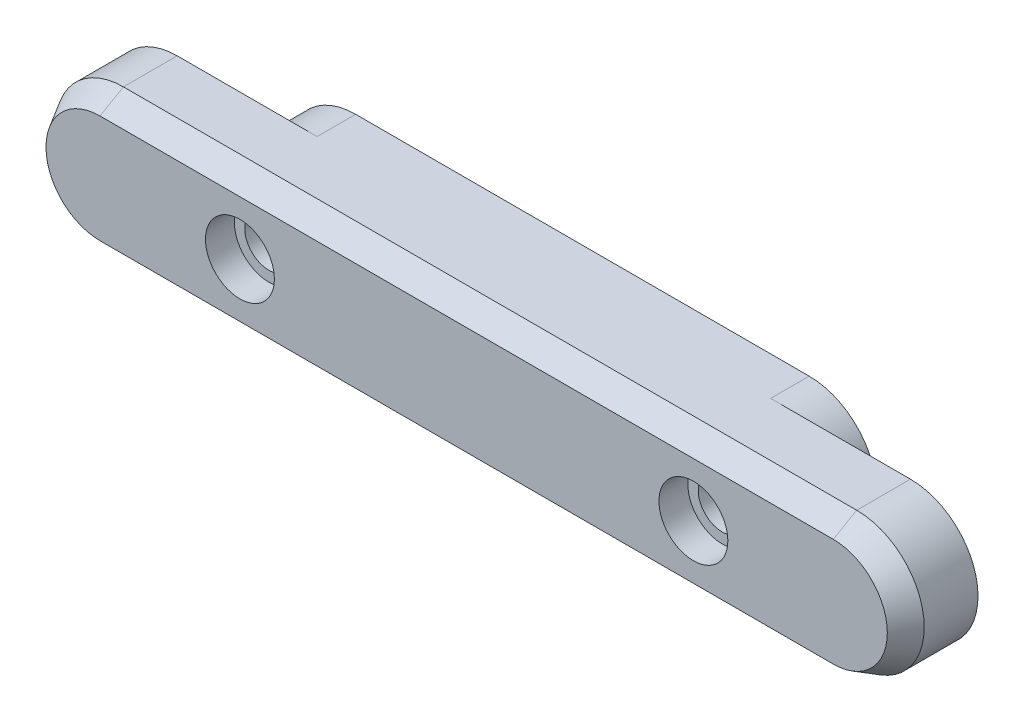
ISO-10303-21;
HEADER;
FILE_DESCRIPTION(('STEP AP214'),'2;1');
FILE_NAME('part.step','',(''),(''),'','','');
FILE_SCHEMA(('AUTOMOTIVE_DESIGN { 1 0 10303 214 1 1 1 1 }'));
ENDSEC;
DATA;
#1=APPLICATION_CONTEXT('core data for automotive mechanical design processes');
#2=APPLICATION_PROTOCOL_DEFINITION('international standard','automotive_design',2000,#1);
#3=PRODUCT_CONTEXT('',#1,'mechanical');
#4=PRODUCT('Part','Part','',(#3));
#5=PRODUCT_RELATED_PRODUCT_CATEGORY('part','',(#4));
#6=PRODUCT_DEFINITION_FORMATION('','',#4);
#7=PRODUCT_DEFINITION_CONTEXT('part definition',#1,'design');
#8=PRODUCT_DEFINITION('design','',#6,#7);
#9=PRODUCT_DEFINITION_SHAPE('','',#8);
#10=(LENGTH_UNIT() NAMED_UNIT(*) SI_UNIT(.MILLI.,.METRE.));
#11=(NAMED_UNIT(*) PLANE_ANGLE_UNIT() SI_UNIT($,.RADIAN.));
#12=(NAMED_UNIT(*) SI_UNIT($,.STERADIAN.) SOLID_ANGLE_UNIT());
#13=UNCERTAINTY_MEASURE_WITH_UNIT(LENGTH_MEASURE(1.E-05),#10,'distance_accuracy_value','');
#14=(GEOMETRIC_REPRESENTATION_CONTEXT(3) GLOBAL_UNCERTAINTY_ASSIGNED_CONTEXT((#13)) GLOBAL_UNIT_ASSIGNED_CONTEXT((#10,
#11,#12)) REPRESENTATION_CONTEXT('',''));
#15=CARTESIAN_POINT('',(0.,0.,0.));
#16=DIRECTION('',(0.,0.,1.));
#17=DIRECTION('',(1.,0.,0.));
#18=AXIS2_PLACEMENT_3D('',#15,#16,#17);
#19=CARTESIAN_POINT('',(11.75,0.,4.));
#20=DIRECTION('',(0.,0.,-1.));
#21=DIRECTION('',(-1.,0.,0.));
#22=AXIS2_PLACEMENT_3D('',#19,#20,#21);
#23=CYLINDRICAL_SURFACE('',#22,1.25);
#24=CARTESIAN_POINT('',(11.75,0.,0.));
#25=DIRECTION('',(0.,0.,1.));
#26=DIRECTION('',(1.,0.,0.));
#27=AXIS2_PLACEMENT_3D('',#24,#25,#26);
#28=CIRCLE('',#27,1.25);
#29=CARTESIAN_POINT('',(13.,0.,0.));
#30=VERTEX_POINT('',#29);
#31=EDGE_CURVE('E146',#30,#30,#28,.T.);
#32=ORIENTED_EDGE('',*,*,#31,.F.);
#33=EDGE_LOOP('',(#32));
#34=FACE_BOUND('',#33,.T.);
#35=CARTESIAN_POINT('',(11.75,0.,2.5));
#36=DIRECTION('',(0.,0.,1.));
#37=DIRECTION('',(1.,0.,0.));
#38=AXIS2_PLACEMENT_3D('',#35,#36,#37);
#39=CIRCLE('',#38,1.25);
#40=CARTESIAN_POINT('',(13.,0.,2.5));
#41=VERTEX_POINT('',#40);
#42=EDGE_CURVE('E38',#41,#41,#39,.T.);
#43=ORIENTED_EDGE('',*,*,#42,.T.);
#44=EDGE_LOOP('',(#43));
#45=FACE_BOUND('',#44,.T.);
#46=ADVANCED_FACE('F34',(#34,#45),#23,.F.);
#47=CARTESIAN_POINT('',(-11.75,0.,4.));
#48=DIRECTION('',(0.,0.,-1.));
#49=DIRECTION('',(-1.,0.,0.));
#50=AXIS2_PLACEMENT_3D('',#47,#48,#49);
#51=CYLINDRICAL_SURFACE('',#50,1.25);
#52=CARTESIAN_POINT('',(-11.75,0.,0.));
#53=DIRECTION('',(0.,0.,1.));
#54=DIRECTION('',(1.,0.,0.));
#55=AXIS2_PLACEMENT_3D('',#52,#53,#54);
#56=CIRCLE('',#55,1.25);
#57=CARTESIAN_POINT('',(-10.5,0.,0.));
#58=VERTEX_POINT('',#57);
#59=EDGE_CURVE('E149',#58,#58,#56,.T.);
#60=ORIENTED_EDGE('',*,*,#59,.F.);
#61=EDGE_LOOP('',(#60));
#62=FACE_BOUND('',#61,.T.);
#63=CARTESIAN_POINT('',(-11.75,0.,2.5));
#64=DIRECTION('',(0.,0.,1.));
#65=DIRECTION('',(1.,0.,0.));
#66=AXIS2_PLACEMENT_3D('',#63,#64,#65);
#67=CIRCLE('',#66,1.25);
#68=CARTESIAN_POINT('',(-10.5,0.,2.5));
#69=VERTEX_POINT('',#68);
#70=EDGE_CURVE('E192',#69,#69,#67,.T.);
#71=ORIENTED_EDGE('',*,*,#70,.T.);
#72=EDGE_LOOP('',(#71));
#73=FACE_BOUND('',#72,.T.);
#74=ADVANCED_FACE('F285',(#62,#73),#51,.F.);
#75=CARTESIAN_POINT('',(0.,0.,0.));
#76=DIRECTION('',(0.,0.,1.));
#77=DIRECTION('',(1.,0.,0.));
#78=AXIS2_PLACEMENT_3D('',#75,#76,#77);
#79=PLANE('',#78);
#80=CARTESIAN_POINT('',(19.,0.,0.));
#81=DIRECTION('',(0.,0.,-1.));
#82=DIRECTION('',(-1.,0.,0.));
#83=AXIS2_PLACEMENT_3D('',#80,#81,#82);
#84=CIRCLE('',#83,1.25);
#85=CARTESIAN_POINT('',(17.75,0.,0.));
#86=VERTEX_POINT('',#85);
#87=EDGE_CURVE('E213',#86,#86,#84,.T.);
#88=ORIENTED_EDGE('',*,*,#87,.F.);
#89=EDGE_LOOP('',(#88));
#90=FACE_BOUND('',#89,.T.);
#91=CARTESIAN_POINT('',(11.75,0.,0.));
#92=DIRECTION('',(0.,0.,-1.));
#93=DIRECTION('',(-1.,0.,0.));
#94=AXIS2_PLACEMENT_3D('',#91,#92,#93);
#95=CIRCLE('',#94,3.5);
#96=CARTESIAN_POINT('',(11.75,3.5,0.));
#97=VERTEX_POINT('',#96);
#98=CARTESIAN_POINT('',(11.75,-3.5,0.));
#99=VERTEX_POINT('',#98);
#100=EDGE_CURVE('E51',#97,#99,#95,.T.);
#101=ORIENTED_EDGE('',*,*,#100,.F.);
#102=DIRECTION('',(1.,0.,0.));
#103=VECTOR('',#102,1.);
#104=CARTESIAN_POINT('',(0.,3.5,0.));
#105=LINE('',#104,#103);
#106=CARTESIAN_POINT('',(19.,3.5,0.));
#107=VERTEX_POINT('',#106);
#108=EDGE_CURVE('E156',#97,#107,#105,.T.);
#109=ORIENTED_EDGE('',*,*,#108,.T.);
#110=CARTESIAN_POINT('',(19.,0.,0.));
#111=DIRECTION('',(0.,0.,1.));
#112=DIRECTION('',(1.,0.,0.));
#113=AXIS2_PLACEMENT_3D('',#110,#111,#112);
#114=CIRCLE('',#113,3.5);
#115=CARTESIAN_POINT('',(19.,-3.5,0.));
#116=VERTEX_POINT('',#115);
#117=EDGE_CURVE('E154',#107,#116,#114,.F.);
#118=ORIENTED_EDGE('',*,*,#117,.T.);
#119=DIRECTION('',(1.,0.,0.));
#120=VECTOR('',#119,1.);
#121=CARTESIAN_POINT('',(0.,-3.5,0.));
#122=LINE('',#121,#120);
#123=EDGE_CURVE('E56',#99,#116,#122,.T.);
#124=ORIENTED_EDGE('',*,*,#123,.F.);
#125=EDGE_LOOP('',(#101,#109,#118,#124));
#126=FACE_BOUND('',#125,.T.);
#127=ADVANCED_FACE('F246',(#90,#126),#79,.F.);
#128=ORIENTED_EDGE('',*,*,#31,.T.);
#129=EDGE_LOOP('',(#128));
#130=FACE_BOUND('',#129,.T.);
#131=CARTESIAN_POINT('',(11.75,0.,0.));
#132=DIRECTION('',(0.,0.,-1.));
#133=DIRECTION('',(-1.,0.,0.));
#134=AXIS2_PLACEMENT_3D('',#131,#132,#133);
#135=CIRCLE('',#134,1.78594);
#136=CARTESIAN_POINT('',(9.96406,0.,0.));
#137=VERTEX_POINT('',#136);
#138=EDGE_CURVE('E232',#137,#137,#135,.T.);
#139=ORIENTED_EDGE('',*,*,#138,.T.);
#140=EDGE_LOOP('',(#139));
#141=FACE_BOUND('',#140,.T.);
#142=ADVANCED_FACE('F482',(#130,#141),#79,.F.);
#143=ORIENTED_EDGE('',*,*,#59,.T.);
#144=EDGE_LOOP('',(#143));
#145=FACE_BOUND('',#144,.T.);
#146=CARTESIAN_POINT('',(-11.75,0.,0.));
#147=DIRECTION('',(0.,0.,-1.));
#148=DIRECTION('',(-1.,0.,0.));
#149=AXIS2_PLACEMENT_3D('',#146,#147,#148);
#150=CIRCLE('',#149,1.78594);
#151=CARTESIAN_POINT('',(-13.53594,0.,0.));
#152=VERTEX_POINT('',#151);
#153=EDGE_CURVE('E131',#152,#152,#150,.T.);
#154=ORIENTED_EDGE('',*,*,#153,.T.);
#155=EDGE_LOOP('',(#154));
#156=FACE_BOUND('',#155,.T.);
#157=ADVANCED_FACE('F283',(#145,#156),#79,.F.);
#158=CARTESIAN_POINT('',(0.,-3.5,4.));
#159=DIRECTION('',(0.,1.,0.));
#160=DIRECTION('',(0.,0.,1.));
#161=AXIS2_PLACEMENT_3D('',#158,#159,#160);
#162=PLANE('',#161);
#163=DIRECTION('',(0.,0.,-1.));
#164=VECTOR('',#163,1.);
#165=CARTESIAN_POINT('',(19.,-3.5,4.));
#166=LINE('',#165,#164);
#167=CARTESIAN_POINT('',(19.,-3.5,2.78756443470179));
#168=VERTEX_POINT('',#167);
#169=EDGE_CURVE('E169',#168,#116,#166,.T.);
#170=ORIENTED_EDGE('',*,*,#169,.F.);
#171=DIRECTION('',(-1.,0.,0.));
#172=VECTOR('',#171,1.);
#173=CARTESIAN_POINT('',(-19.,-3.5,2.78756443470179));
#174=LINE('',#173,#172);
#175=CARTESIAN_POINT('',(-19.,-3.5,2.78756443470179));
#176=VERTEX_POINT('',#175);
#177=EDGE_CURVE('E181',#168,#176,#174,.T.);
#178=ORIENTED_EDGE('',*,*,#177,.T.);
#179=DIRECTION('',(0.,0.,-1.));
#180=VECTOR('',#179,1.);
#181=CARTESIAN_POINT('',(-19.,-3.5,4.));
#182=LINE('',#181,#180);
#183=CARTESIAN_POINT('',(-19.,-3.5,0.));
#184=VERTEX_POINT('',#183);
#185=EDGE_CURVE('E162',#176,#184,#182,.T.);
#186=ORIENTED_EDGE('',*,*,#185,.T.);
#187=CARTESIAN_POINT('',(-11.75,-3.5,0.));
#188=VERTEX_POINT('',#187);
#189=EDGE_CURVE('E137',#184,#188,#122,.T.);
#190=ORIENTED_EDGE('',*,*,#189,.T.);
#191=DIRECTION('',(0.,0.,1.));
#192=VECTOR('',#191,1.);
#193=CARTESIAN_POINT('',(-11.75,-3.5,-2.));
#194=LINE('',#193,#192);
#195=CARTESIAN_POINT('',(-11.75,-3.5,-2.));
#196=VERTEX_POINT('',#195);
#197=EDGE_CURVE('E115',#196,#188,#194,.T.);
#198=ORIENTED_EDGE('',*,*,#197,.F.);
#199=DIRECTION('',(-1.,0.,0.));
#200=VECTOR('',#199,1.);
#201=CARTESIAN_POINT('',(0.,-3.5,-2.));
#202=LINE('',#201,#200);
#203=CARTESIAN_POINT('',(11.75,-3.5,-2.));
#204=VERTEX_POINT('',#203);
#205=EDGE_CURVE('E121',#204,#196,#202,.T.);
#206=ORIENTED_EDGE('',*,*,#205,.F.);
#207=DIRECTION('',(0.,0.,1.));
#208=VECTOR('',#207,1.);
#209=CARTESIAN_POINT('',(11.75,-3.5,-2.));
#210=LINE('',#209,#208);
#211=EDGE_CURVE('E229',#204,#99,#210,.T.);
#212=ORIENTED_EDGE('',*,*,#211,.T.);
#213=ORIENTED_EDGE('',*,*,#123,.T.);
#214=EDGE_LOOP('',(#170,#178,#186,#190,#198,#206,#212,#213));
#215=FACE_BOUND('',#214,.T.);
#216=ADVANCED_FACE('F135',(#215),#162,.F.);
#217=CARTESIAN_POINT('',(19.,0.,4.));
#218=DIRECTION('',(0.,0.,-1.));
#219=DIRECTION('',(-1.,0.,0.));
#220=AXIS2_PLACEMENT_3D('',#217,#218,#219);
#221=CYLINDRICAL_SURFACE('',#220,3.5);
#222=DIRECTION('',(0.,0.,-1.));
#223=VECTOR('',#222,1.);
#224=CARTESIAN_POINT('',(19.,3.5,4.));
#225=LINE('',#224,#223);
#226=CARTESIAN_POINT('',(19.,3.5,2.78756443470179));
#227=VERTEX_POINT('',#226);
#228=EDGE_CURVE('E166',#227,#107,#225,.T.);
#229=ORIENTED_EDGE('',*,*,#228,.F.);
#230=CARTESIAN_POINT('',(19.,0.,2.78756443470179));
#231=DIRECTION('',(0.,0.,1.));
#232=DIRECTION('',(1.,0.,0.));
#233=AXIS2_PLACEMENT_3D('',#230,#231,#232);
#234=CIRCLE('',#233,3.5);
#235=EDGE_CURVE('E43',#227,#168,#234,.F.);
#236=ORIENTED_EDGE('',*,*,#235,.T.);
#237=ORIENTED_EDGE('',*,*,#169,.T.);
#238=ORIENTED_EDGE('',*,*,#117,.F.);
#239=EDGE_LOOP('',(#229,#236,#237,#238));
#240=FACE_BOUND('',#239,.T.);
#241=ADVANCED_FACE('F248',(#240),#221,.T.);
#242=CARTESIAN_POINT('',(0.,3.5,4.));
#243=DIRECTION('',(0.,1.,0.));
#244=DIRECTION('',(0.,0.,1.));
#245=AXIS2_PLACEMENT_3D('',#242,#243,#244);
#246=PLANE('',#245);
#247=DIRECTION('',(0.,0.,-1.));
#248=VECTOR('',#247,1.);
#249=CARTESIAN_POINT('',(-19.,3.5,4.));
#250=LINE('',#249,#248);
#251=CARTESIAN_POINT('',(-19.,3.5,2.78756443470179));
#252=VERTEX_POINT('',#251);
#253=CARTESIAN_POINT('',(-19.,3.5,0.));
#254=VERTEX_POINT('',#253);
#255=EDGE_CURVE('E164',#252,#254,#250,.T.);
#256=ORIENTED_EDGE('',*,*,#255,.F.);
#257=DIRECTION('',(1.,0.,0.));
#258=VECTOR('',#257,1.);
#259=CARTESIAN_POINT('',(0.,3.5,2.78756443470179));
#260=LINE('',#259,#258);
#261=EDGE_CURVE('E11',#252,#227,#260,.T.);
#262=ORIENTED_EDGE('',*,*,#261,.T.);
#263=ORIENTED_EDGE('',*,*,#228,.T.);
#264=ORIENTED_EDGE('',*,*,#108,.F.);
#265=DIRECTION('',(0.,0.,1.));
#266=VECTOR('',#265,1.);
#267=CARTESIAN_POINT('',(11.75,3.5,-2.));
#268=LINE('',#267,#266);
#269=CARTESIAN_POINT('',(11.75,3.5,-2.));
#270=VERTEX_POINT('',#269);
#271=EDGE_CURVE('E142',#270,#97,#268,.T.);
#272=ORIENTED_EDGE('',*,*,#271,.F.);
#273=DIRECTION('',(1.,0.,0.));
#274=VECTOR('',#273,1.);
#275=CARTESIAN_POINT('',(0.,3.5,-2.));
#276=LINE('',#275,#274);
#277=CARTESIAN_POINT('',(-11.75,3.5,-2.));
#278=VERTEX_POINT('',#277);
#279=EDGE_CURVE('E120',#278,#270,#276,.T.);
#280=ORIENTED_EDGE('',*,*,#279,.F.);
#281=DIRECTION('',(0.,0.,1.));
#282=VECTOR('',#281,1.);
#283=CARTESIAN_POINT('',(-11.75,3.5,-2.));
#284=LINE('',#283,#282);
#285=CARTESIAN_POINT('',(-11.75,3.5,0.));
#286=VERTEX_POINT('',#285);
#287=EDGE_CURVE('E117',#278,#286,#284,.T.);
#288=ORIENTED_EDGE('',*,*,#287,.T.);
#289=EDGE_CURVE('E157',#254,#286,#105,.T.);
#290=ORIENTED_EDGE('',*,*,#289,.F.);
#291=EDGE_LOOP('',(#256,#262,#263,#264,#272,#280,#288,#290));
#292=FACE_BOUND('',#291,.T.);
#293=ADVANCED_FACE('F243',(#292),#246,.T.);
#294=CARTESIAN_POINT('',(-19.,0.,4.));
#295=DIRECTION('',(0.,0.,-1.));
#296=DIRECTION('',(-1.,0.,0.));
#297=AXIS2_PLACEMENT_3D('',#294,#295,#296);
#298=CYLINDRICAL_SURFACE('',#297,3.5);
#299=ORIENTED_EDGE('',*,*,#185,.F.);
#300=CARTESIAN_POINT('',(-19.,0.,2.78756443470179));
#301=DIRECTION('',(0.,0.,1.));
#302=DIRECTION('',(1.,0.,0.));
#303=AXIS2_PLACEMENT_3D('',#300,#301,#302);
#304=CIRCLE('',#303,3.5);
#305=EDGE_CURVE('E184',#176,#252,#304,.F.);
#306=ORIENTED_EDGE('',*,*,#305,.T.);
#307=ORIENTED_EDGE('',*,*,#255,.T.);
#308=CARTESIAN_POINT('',(-19.,0.,0.));
#309=DIRECTION('',(0.,0.,1.));
#310=DIRECTION('',(1.,0.,0.));
#311=AXIS2_PLACEMENT_3D('',#308,#309,#310);
#312=CIRCLE('',#311,3.5);
#313=EDGE_CURVE('E159',#254,#184,#312,.T.);
#314=ORIENTED_EDGE('',*,*,#313,.T.);
#315=EDGE_LOOP('',(#299,#306,#307,#314));
#316=FACE_BOUND('',#315,.T.);
#317=ADVANCED_FACE('F270',(#316),#298,.T.);
#318=CARTESIAN_POINT('',(0.,0.,4.));
#319=DIRECTION('',(0.,0.,1.));
#320=DIRECTION('',(1.,0.,0.));
#321=AXIS2_PLACEMENT_3D('',#318,#319,#320);
#322=PLANE('',#321);
#323=CARTESIAN_POINT('',(11.75,0.,4.));
#324=DIRECTION('',(0.,0.,1.));
#325=DIRECTION('',(1.,0.,0.));
#326=AXIS2_PLACEMENT_3D('',#323,#324,#325);
#327=CIRCLE('',#326,1.78594);
#328=CARTESIAN_POINT('',(13.53594,0.,4.));
#329=VERTEX_POINT('',#328);
#330=EDGE_CURVE('E209',#329,#329,#327,.T.);
#331=ORIENTED_EDGE('',*,*,#330,.F.);
#332=EDGE_LOOP('',(#331));
#333=FACE_BOUND('',#332,.T.);
#334=CARTESIAN_POINT('',(-11.75,0.,4.));
#335=DIRECTION('',(0.,0.,1.));
#336=DIRECTION('',(1.,0.,0.));
#337=AXIS2_PLACEMENT_3D('',#334,#335,#336);
#338=CIRCLE('',#337,1.78594);
#339=CARTESIAN_POINT('',(-9.96406,0.,4.));
#340=VERTEX_POINT('',#339);
#341=EDGE_CURVE('E202',#340,#340,#338,.T.);
#342=ORIENTED_EDGE('',*,*,#341,.F.);
#343=EDGE_LOOP('',(#342));
#344=FACE_BOUND('',#343,.T.);
#345=CARTESIAN_POINT('',(-19.,0.,4.));
#346=DIRECTION('',(0.,0.,1.));
#347=DIRECTION('',(1.,0.,0.));
#348=AXIS2_PLACEMENT_3D('',#345,#346,#347);
#349=CIRCLE('',#348,2.8);
#350=CARTESIAN_POINT('',(-19.,2.8,4.));
#351=VERTEX_POINT('',#350);
#352=CARTESIAN_POINT('',(-19.,-2.8,4.));
#353=VERTEX_POINT('',#352);
#354=EDGE_CURVE('E176',#351,#353,#349,.T.);
#355=ORIENTED_EDGE('',*,*,#354,.T.);
#356=DIRECTION('',(1.,0.,0.));
#357=VECTOR('',#356,1.);
#358=CARTESIAN_POINT('',(19.,-2.8,4.));
#359=LINE('',#358,#357);
#360=CARTESIAN_POINT('',(19.,-2.8,4.));
#361=VERTEX_POINT('',#360);
#362=EDGE_CURVE('E178',#353,#361,#359,.T.);
#363=ORIENTED_EDGE('',*,*,#362,.T.);
#364=CARTESIAN_POINT('',(19.,0.,4.));
#365=DIRECTION('',(0.,0.,1.));
#366=DIRECTION('',(1.,0.,0.));
#367=AXIS2_PLACEMENT_3D('',#364,#365,#366);
#368=CIRCLE('',#367,2.8);
#369=CARTESIAN_POINT('',(19.,2.8,4.));
#370=VERTEX_POINT('',#369);
#371=EDGE_CURVE('E174',#361,#370,#368,.T.);
#372=ORIENTED_EDGE('',*,*,#371,.T.);
#373=DIRECTION('',(-1.,0.,0.));
#374=VECTOR('',#373,1.);
#375=CARTESIAN_POINT('',(0.,2.8,4.));
#376=LINE('',#375,#374);
#377=EDGE_CURVE('E172',#370,#351,#376,.T.);
#378=ORIENTED_EDGE('',*,*,#377,.T.);
#379=EDGE_LOOP('',(#355,#363,#372,#378));
#380=FACE_BOUND('',#379,.T.);
#381=ADVANCED_FACE('F264',(#333,#344,#380),#322,.T.);
#382=CARTESIAN_POINT('',(-19.,0.,0.));
#383=DIRECTION('',(0.,0.,-1.));
#384=DIRECTION('',(-1.,0.,0.));
#385=AXIS2_PLACEMENT_3D('',#382,#383,#384);
#386=CIRCLE('',#385,1.25);
#387=CARTESIAN_POINT('',(-20.25,0.,0.));
#388=VERTEX_POINT('',#387);
#389=EDGE_CURVE('E194',#388,#388,#386,.T.);
#390=ORIENTED_EDGE('',*,*,#389,.F.);
#391=EDGE_LOOP('',(#390));
#392=FACE_BOUND('',#391,.T.);
#393=CARTESIAN_POINT('',(-11.75,0.,0.));
#394=DIRECTION('',(0.,0.,-1.));
#395=DIRECTION('',(-1.,0.,0.));
#396=AXIS2_PLACEMENT_3D('',#393,#394,#395);
#397=CIRCLE('',#396,3.5);
#398=EDGE_CURVE('E218',#188,#286,#397,.T.);
#399=ORIENTED_EDGE('',*,*,#398,.F.);
#400=ORIENTED_EDGE('',*,*,#189,.F.);
#401=ORIENTED_EDGE('',*,*,#313,.F.);
#402=ORIENTED_EDGE('',*,*,#289,.T.);
#403=EDGE_LOOP('',(#399,#400,#401,#402));
#404=FACE_BOUND('',#403,.T.);
#405=ADVANCED_FACE('F276',(#392,#404),#79,.F.);
#406=CARTESIAN_POINT('',(0.,3.5,2.78756443470179));
#407=DIRECTION('',(0.,-0.866025403784438,-0.500000000000001));
#408=DIRECTION('',(1.,0.,0.));
#409=AXIS2_PLACEMENT_3D('',#406,#407,#408);
#410=PLANE('',#409);
#411=DIRECTION('',(0.,-0.500000000000001,0.866025403784438));
#412=VECTOR('',#411,1.);
#413=CARTESIAN_POINT('',(19.,3.5,2.78756443470179));
#414=LINE('',#413,#412);
#415=EDGE_CURVE('E188',#227,#370,#414,.T.);
#416=ORIENTED_EDGE('',*,*,#415,.F.);
#417=ORIENTED_EDGE('',*,*,#261,.F.);
#418=DIRECTION('',(0.,0.500000000000001,-0.866025403784438));
#419=VECTOR('',#418,1.);
#420=CARTESIAN_POINT('',(-19.,2.8,4.));
#421=LINE('',#420,#419);
#422=EDGE_CURVE('E150',#351,#252,#421,.T.);
#423=ORIENTED_EDGE('',*,*,#422,.F.);
#424=ORIENTED_EDGE('',*,*,#377,.F.);
#425=EDGE_LOOP('',(#416,#417,#423,#424));
#426=FACE_BOUND('',#425,.T.);
#427=ADVANCED_FACE('F36',(#426),#410,.F.);
#428=CARTESIAN_POINT('',(-19.,0.,4.));
#429=DIRECTION('',(0.,0.,-1.));
#430=DIRECTION('',(-1.,0.,0.));
#431=AXIS2_PLACEMENT_3D('',#428,#429,#430);
#432=CONICAL_SURFACE('',#431,2.8,0.5235987755983);
#433=ORIENTED_EDGE('',*,*,#422,.T.);
#434=ORIENTED_EDGE('',*,*,#305,.F.);
#435=DIRECTION('',(0.,-0.500000000000001,-0.866025403784438));
#436=VECTOR('',#435,1.);
#437=CARTESIAN_POINT('',(-19.,-2.8,4.));
#438=LINE('',#437,#436);
#439=EDGE_CURVE('E140',#353,#176,#438,.T.);
#440=ORIENTED_EDGE('',*,*,#439,.F.);
#441=ORIENTED_EDGE('',*,*,#354,.F.);
#442=EDGE_LOOP('',(#433,#434,#440,#441));
#443=FACE_BOUND('',#442,.T.);
#444=ADVANCED_FACE('F268',(#443),#432,.T.);
#445=CARTESIAN_POINT('',(19.,0.,2.78756443470179));
#446=DIRECTION('',(0.,0.,-1.));
#447=DIRECTION('',(-1.,0.,0.));
#448=AXIS2_PLACEMENT_3D('',#445,#446,#447);
#449=CONICAL_SURFACE('',#448,3.5,0.5235987755983);
#450=ORIENTED_EDGE('',*,*,#415,.T.);
#451=ORIENTED_EDGE('',*,*,#371,.F.);
#452=DIRECTION('',(0.,0.500000000000001,0.866025403784438));
#453=VECTOR('',#452,1.);
#454=CARTESIAN_POINT('',(19.,-3.5,2.78756443470179));
#455=LINE('',#454,#453);
#456=EDGE_CURVE('E138',#168,#361,#455,.T.);
#457=ORIENTED_EDGE('',*,*,#456,.F.);
#458=ORIENTED_EDGE('',*,*,#235,.F.);
#459=EDGE_LOOP('',(#450,#451,#457,#458));
#460=FACE_BOUND('',#459,.T.);
#461=ADVANCED_FACE('F261',(#460),#449,.T.);
#462=CARTESIAN_POINT('',(0.,-2.8,4.));
#463=DIRECTION('',(0.,-0.866025403784438,0.500000000000001));
#464=DIRECTION('',(-1.,0.,0.));
#465=AXIS2_PLACEMENT_3D('',#462,#463,#464);
#466=PLANE('',#465);
#467=ORIENTED_EDGE('',*,*,#439,.T.);
#468=ORIENTED_EDGE('',*,*,#177,.F.);
#469=ORIENTED_EDGE('',*,*,#456,.T.);
#470=ORIENTED_EDGE('',*,*,#362,.F.);
#471=EDGE_LOOP('',(#467,#468,#469,#470));
#472=FACE_BOUND('',#471,.T.);
#473=ADVANCED_FACE('F255',(#472),#466,.T.);
#474=CARTESIAN_POINT('',(-11.75,0.,-2.));
#475=DIRECTION('',(0.,0.,1.));
#476=DIRECTION('',(1.,0.,0.));
#477=AXIS2_PLACEMENT_3D('',#474,#475,#476);
#478=CYLINDRICAL_SURFACE('',#477,3.5);
#479=ORIENTED_EDGE('',*,*,#398,.T.);
#480=ORIENTED_EDGE('',*,*,#287,.F.);
#481=CARTESIAN_POINT('',(-11.75,0.,-2.));
#482=DIRECTION('',(0.,0.,-1.));
#483=DIRECTION('',(-1.,0.,0.));
#484=AXIS2_PLACEMENT_3D('',#481,#482,#483);
#485=CIRCLE('',#484,3.5);
#486=EDGE_CURVE('E110',#196,#278,#485,.T.);
#487=ORIENTED_EDGE('',*,*,#486,.F.);
#488=ORIENTED_EDGE('',*,*,#197,.T.);
#489=EDGE_LOOP('',(#479,#480,#487,#488));
#490=FACE_BOUND('',#489,.T.);
#491=ADVANCED_FACE('F113',(#490),#478,.T.);
#492=CARTESIAN_POINT('',(11.75,0.,-2.));
#493=DIRECTION('',(0.,0.,1.));
#494=DIRECTION('',(1.,0.,0.));
#495=AXIS2_PLACEMENT_3D('',#492,#493,#494);
#496=CYLINDRICAL_SURFACE('',#495,1.78594);
#497=CARTESIAN_POINT('',(11.75,0.,-2.));
#498=DIRECTION('',(0.,0.,-1.));
#499=DIRECTION('',(-1.,0.,0.));
#500=AXIS2_PLACEMENT_3D('',#497,#498,#499);
#501=CIRCLE('',#500,1.78594);
#502=CARTESIAN_POINT('',(9.96406,0.,-2.));
#503=VERTEX_POINT('',#502);
#504=EDGE_CURVE('E223',#503,#503,#501,.T.);
#505=ORIENTED_EDGE('',*,*,#504,.T.);
#506=EDGE_LOOP('',(#505));
#507=FACE_BOUND('',#506,.T.);
#508=ORIENTED_EDGE('',*,*,#138,.F.);
#509=EDGE_LOOP('',(#508));
#510=FACE_BOUND('',#509,.T.);
#511=ADVANCED_FACE('F315',(#507,#510),#496,.F.);
#512=CARTESIAN_POINT('',(11.75,0.,-2.));
#513=DIRECTION('',(0.,0.,1.));
#514=DIRECTION('',(1.,0.,0.));
#515=AXIS2_PLACEMENT_3D('',#512,#513,#514);
#516=CYLINDRICAL_SURFACE('',#515,3.5);
#517=ORIENTED_EDGE('',*,*,#100,.T.);
#518=ORIENTED_EDGE('',*,*,#211,.F.);
#519=CARTESIAN_POINT('',(11.75,0.,-2.));
#520=DIRECTION('',(0.,0.,-1.));
#521=DIRECTION('',(-1.,0.,0.));
#522=AXIS2_PLACEMENT_3D('',#519,#520,#521);
#523=CIRCLE('',#522,3.5);
#524=EDGE_CURVE('E127',#270,#204,#523,.T.);
#525=ORIENTED_EDGE('',*,*,#524,.F.);
#526=ORIENTED_EDGE('',*,*,#271,.T.);
#527=EDGE_LOOP('',(#517,#518,#525,#526));
#528=FACE_BOUND('',#527,.T.);
#529=ADVANCED_FACE('F240',(#528),#516,.T.);
#530=CARTESIAN_POINT('',(-11.75,0.,-2.));
#531=DIRECTION('',(0.,0.,1.));
#532=DIRECTION('',(1.,0.,0.));
#533=AXIS2_PLACEMENT_3D('',#530,#531,#532);
#534=CYLINDRICAL_SURFACE('',#533,1.78594);
#535=CARTESIAN_POINT('',(-11.75,0.,-2.));
#536=DIRECTION('',(0.,0.,-1.));
#537=DIRECTION('',(-1.,0.,0.));
#538=AXIS2_PLACEMENT_3D('',#535,#536,#537);
#539=CIRCLE('',#538,1.78594);
#540=CARTESIAN_POINT('',(-13.53594,0.,-2.));
#541=VERTEX_POINT('',#540);
#542=EDGE_CURVE('E226',#541,#541,#539,.T.);
#543=ORIENTED_EDGE('',*,*,#542,.T.);
#544=EDGE_LOOP('',(#543));
#545=FACE_BOUND('',#544,.T.);
#546=ORIENTED_EDGE('',*,*,#153,.F.);
#547=EDGE_LOOP('',(#546));
#548=FACE_BOUND('',#547,.T.);
#549=ADVANCED_FACE('F330',(#545,#548),#534,.F.);
#550=CARTESIAN_POINT('',(0.,0.,-2.));
#551=DIRECTION('',(0.,0.,-1.));
#552=DIRECTION('',(-1.,0.,0.));
#553=AXIS2_PLACEMENT_3D('',#550,#551,#552);
#554=PLANE('',#553);
#555=ORIENTED_EDGE('',*,*,#205,.T.);
#556=ORIENTED_EDGE('',*,*,#486,.T.);
#557=ORIENTED_EDGE('',*,*,#279,.T.);
#558=ORIENTED_EDGE('',*,*,#524,.T.);
#559=EDGE_LOOP('',(#555,#556,#557,#558));
#560=FACE_BOUND('',#559,.T.);
#561=ORIENTED_EDGE('',*,*,#504,.F.);
#562=EDGE_LOOP('',(#561));
#563=FACE_BOUND('',#562,.T.);
#564=ORIENTED_EDGE('',*,*,#542,.F.);
#565=EDGE_LOOP('',(#564));
#566=FACE_BOUND('',#565,.T.);
#567=ADVANCED_FACE('F124',(#560,#563,#566),#554,.T.);
#568=CARTESIAN_POINT('',(19.,0.,3.5));
#569=DIRECTION('',(0.,0.,-1.));
#570=DIRECTION('',(-1.,0.,0.));
#571=AXIS2_PLACEMENT_3D('',#568,#569,#570);
#572=CYLINDRICAL_SURFACE('',#571,1.25);
#573=CARTESIAN_POINT('',(19.,0.,3.5));
#574=DIRECTION('',(0.,0.,-1.));
#575=DIRECTION('',(-1.,0.,0.));
#576=AXIS2_PLACEMENT_3D('',#573,#574,#575);
#577=CIRCLE('',#576,1.25);
#578=CARTESIAN_POINT('',(17.75,0.,3.5));
#579=VERTEX_POINT('',#578);
#580=EDGE_CURVE('E215',#579,#579,#577,.T.);
#581=CARTESIAN_POINT('',(17.75,0.,3.5));
#582=CARTESIAN_POINT('',(17.75,0.,3.46354166666667));
#583=CARTESIAN_POINT('',(17.75,0.,3.42708333333333));
#584=CARTESIAN_POINT('',(17.75,0.,3.35416666666667));
#585=CARTESIAN_POINT('',(17.75,0.,3.31770833333333));
#586=CARTESIAN_POINT('',(17.75,0.,3.24479166666667));
#587=CARTESIAN_POINT('',(17.75,0.,3.20833333333333));
#588=CARTESIAN_POINT('',(17.75,0.,3.13541666666667));
#589=CARTESIAN_POINT('',(17.75,0.,3.09895833333333));
#590=CARTESIAN_POINT('',(17.75,0.,3.02604166666667));
#591=CARTESIAN_POINT('',(17.75,0.,2.98958333333333));
#592=CARTESIAN_POINT('',(17.75,0.,2.91666666666667));
#593=CARTESIAN_POINT('',(17.75,0.,2.88020833333333));
#594=CARTESIAN_POINT('',(17.75,0.,2.80729166666667));
#595=CARTESIAN_POINT('',(17.75,0.,2.77083333333333));
#596=CARTESIAN_POINT('',(17.75,0.,2.69791666666667));
#597=CARTESIAN_POINT('',(17.75,0.,2.66145833333333));
#598=CARTESIAN_POINT('',(17.75,0.,2.58854166666667));
#599=CARTESIAN_POINT('',(17.75,0.,2.55208333333333));
#600=CARTESIAN_POINT('',(17.75,0.,2.47916666666667));
#601=CARTESIAN_POINT('',(17.75,0.,2.44270833333333));
#602=CARTESIAN_POINT('',(17.75,0.,2.36979166666667));
#603=CARTESIAN_POINT('',(17.75,0.,2.33333333333333));
#604=CARTESIAN_POINT('',(17.75,0.,2.26041666666667));
#605=CARTESIAN_POINT('',(17.75,0.,2.22395833333333));
#606=CARTESIAN_POINT('',(17.75,0.,2.15104166666667));
#607=CARTESIAN_POINT('',(17.75,0.,2.11458333333333));
#608=CARTESIAN_POINT('',(17.75,0.,2.04166666666667));
#609=CARTESIAN_POINT('',(17.75,0.,2.00520833333333));
#610=CARTESIAN_POINT('',(17.75,0.,1.93229166666667));
#611=CARTESIAN_POINT('',(17.75,0.,1.89583333333333));
#612=CARTESIAN_POINT('',(17.75,0.,1.82291666666667));
#613=CARTESIAN_POINT('',(17.75,0.,1.78645833333333));
#614=CARTESIAN_POINT('',(17.75,0.,1.71354166666667));
#615=CARTESIAN_POINT('',(17.75,0.,1.67708333333333));
#616=CARTESIAN_POINT('',(17.75,0.,1.60416666666667));
#617=CARTESIAN_POINT('',(17.75,0.,1.56770833333333));
#618=CARTESIAN_POINT('',(17.75,0.,1.49479166666667));
#619=CARTESIAN_POINT('',(17.75,0.,1.45833333333333));
#620=CARTESIAN_POINT('',(17.75,0.,1.38541666666667));
#621=CARTESIAN_POINT('',(17.75,0.,1.34895833333333));
#622=CARTESIAN_POINT('',(17.75,0.,1.27604166666667));
#623=CARTESIAN_POINT('',(17.75,0.,1.23958333333333));
#624=CARTESIAN_POINT('',(17.75,0.,1.16666666666667));
#625=CARTESIAN_POINT('',(17.75,0.,1.13020833333333));
#626=CARTESIAN_POINT('',(17.75,0.,1.05729166666667));
#627=CARTESIAN_POINT('',(17.75,0.,1.02083333333333));
#628=CARTESIAN_POINT('',(17.75,0.,0.947916666666667));
#629=CARTESIAN_POINT('',(17.75,0.,0.911458333333334));
#630=CARTESIAN_POINT('',(17.75,0.,0.838541666666667));
#631=CARTESIAN_POINT('',(17.75,0.,0.802083333333334));
#632=CARTESIAN_POINT('',(17.75,0.,0.729166666666667));
#633=CARTESIAN_POINT('',(17.75,0.,0.692708333333333));
#634=CARTESIAN_POINT('',(17.75,0.,0.619791666666667));
#635=CARTESIAN_POINT('',(17.75,0.,0.583333333333334));
#636=CARTESIAN_POINT('',(17.75,0.,0.510416666666667));
#637=CARTESIAN_POINT('',(17.75,0.,0.473958333333334));
#638=CARTESIAN_POINT('',(17.75,0.,0.401041666666667));
#639=CARTESIAN_POINT('',(17.75,0.,0.364583333333334));
#640=CARTESIAN_POINT('',(17.75,0.,0.291666666666667));
#641=CARTESIAN_POINT('',(17.75,0.,0.255208333333334));
#642=CARTESIAN_POINT('',(17.75,0.,0.182291666666667));
#643=CARTESIAN_POINT('',(17.75,0.,0.145833333333334));
#644=CARTESIAN_POINT('',(17.75,0.,0.0729166666666671));
#645=CARTESIAN_POINT('',(17.75,0.,0.0364583333333337));
#646=CARTESIAN_POINT('',(17.75,0.,0.));
#647=B_SPLINE_CURVE_WITH_KNOTS('',3,(#581,#582,#583,#584,#585,#586,#587,#588,#589,#590,#591,
#592,#593,#594,#595,#596,#597,#598,#599,#600,#601,#602,#603,#604,#605,#606,#607,#608,#609,#610,
#611,#612,#613,#614,#615,#616,#617,#618,#619,#620,#621,#622,#623,#624,#625,#626,#627,#628,#629,
#630,#631,#632,#633,#634,#635,#636,#637,#638,#639,#640,#641,#642,#643,#644,#645,#646),
.UNSPECIFIED.,.F.,.F.,(4,2,2,2,2,2,2,2,2,2,2,2,2,2,2,2,2,2,2,2,2,2,2,2,2,2,2,2,2,2,2,2,4),(0.,
0.109375,0.21875,0.328125,0.4375,0.546875,0.65625,0.765625,0.874999999999999,0.984375,1.09375,
1.203125,1.3125,1.421875,1.53125,1.640625,1.75,1.859375,1.96875,2.078125,2.1875,2.296875,
2.40625,2.515625,2.625,2.734375,2.84375,2.953125,3.0625,3.171875,3.28125,3.390625,3.5),.UNSPECIFIED.);
#648=EDGE_CURVE('BSEAM344',#579,#86,#647,.T.);
#649=ORIENTED_EDGE('',*,*,#580,.F.);
#650=ORIENTED_EDGE('',*,*,#87,.T.);
#651=ORIENTED_EDGE('',*,*,#648,.T.);
#652=ORIENTED_EDGE('',*,*,#648,.F.);
#653=EDGE_LOOP('',(#649,#651,#650,#652));
#654=FACE_BOUND('',#653,.T.);
#655=ADVANCED_FACE('F344',(#654),#572,.F.);
#656=CARTESIAN_POINT('',(19.,0.,3.5));
#657=DIRECTION('',(0.,0.,-1.));
#658=DIRECTION('',(-1.,0.,0.));
#659=AXIS2_PLACEMENT_3D('',#656,#657,#658);
#660=PLANE('',#659);
#661=ORIENTED_EDGE('',*,*,#580,.T.);
#662=EDGE_LOOP('',(#661));
#663=FACE_BOUND('',#662,.T.);
#664=ADVANCED_FACE('F352',(#663),#660,.T.);
#665=CARTESIAN_POINT('',(-19.,0.,3.5));
#666=DIRECTION('',(0.,0.,-1.));
#667=DIRECTION('',(-1.,0.,0.));
#668=AXIS2_PLACEMENT_3D('',#665,#666,#667);
#669=CYLINDRICAL_SURFACE('',#668,1.25);
#670=CARTESIAN_POINT('',(-19.,0.,3.5));
#671=DIRECTION('',(0.,0.,-1.));
#672=DIRECTION('',(-1.,0.,0.));
#673=AXIS2_PLACEMENT_3D('',#670,#671,#672);
#674=CIRCLE('',#673,1.25);
#675=CARTESIAN_POINT('',(-20.25,0.,3.5));
#676=VERTEX_POINT('',#675);
#677=EDGE_CURVE('E199',#676,#676,#674,.T.);
#678=CARTESIAN_POINT('',(-20.25,0.,3.5));
#679=CARTESIAN_POINT('',(-20.25,0.,3.46354166666667));
#680=CARTESIAN_POINT('',(-20.25,0.,3.42708333333333));
#681=CARTESIAN_POINT('',(-20.25,0.,3.35416666666667));
#682=CARTESIAN_POINT('',(-20.25,0.,3.31770833333333));
#683=CARTESIAN_POINT('',(-20.25,0.,3.24479166666667));
#684=CARTESIAN_POINT('',(-20.25,0.,3.20833333333333));
#685=CARTESIAN_POINT('',(-20.25,0.,3.13541666666667));
#686=CARTESIAN_POINT('',(-20.25,0.,3.09895833333333));
#687=CARTESIAN_POINT('',(-20.25,0.,3.02604166666667));
#688=CARTESIAN_POINT('',(-20.25,0.,2.98958333333333));
#689=CARTESIAN_POINT('',(-20.25,0.,2.91666666666667));
#690=CARTESIAN_POINT('',(-20.25,0.,2.88020833333333));
#691=CARTESIAN_POINT('',(-20.25,0.,2.80729166666667));
#692=CARTESIAN_POINT('',(-20.25,0.,2.77083333333333));
#693=CARTESIAN_POINT('',(-20.25,0.,2.69791666666667));
#694=CARTESIAN_POINT('',(-20.25,0.,2.66145833333333));
#695=CARTESIAN_POINT('',(-20.25,0.,2.58854166666667));
#696=CARTESIAN_POINT('',(-20.25,0.,2.55208333333333));
#697=CARTESIAN_POINT('',(-20.25,0.,2.47916666666667));
#698=CARTESIAN_POINT('',(-20.25,0.,2.44270833333333));
#699=CARTESIAN_POINT('',(-20.25,0.,2.36979166666667));
#700=CARTESIAN_POINT('',(-20.25,0.,2.33333333333333));
#701=CARTESIAN_POINT('',(-20.25,0.,2.26041666666667));
#702=CARTESIAN_POINT('',(-20.25,0.,2.22395833333333));
#703=CARTESIAN_POINT('',(-20.25,0.,2.15104166666667));
#704=CARTESIAN_POINT('',(-20.25,0.,2.11458333333333));
#705=CARTESIAN_POINT('',(-20.25,0.,2.04166666666667));
#706=CARTESIAN_POINT('',(-20.25,0.,2.00520833333333));
#707=CARTESIAN_POINT('',(-20.25,0.,1.93229166666667));
#708=CARTESIAN_POINT('',(-20.25,0.,1.89583333333333));
#709=CARTESIAN_POINT('',(-20.25,0.,1.82291666666667));
#710=CARTESIAN_POINT('',(-20.25,0.,1.78645833333333));
#711=CARTESIAN_POINT('',(-20.25,0.,1.71354166666667));
#712=CARTESIAN_POINT('',(-20.25,0.,1.67708333333333));
#713=CARTESIAN_POINT('',(-20.25,0.,1.60416666666667));
#714=CARTESIAN_POINT('',(-20.25,0.,1.56770833333333));
#715=CARTESIAN_POINT('',(-20.25,0.,1.49479166666667));
#716=CARTESIAN_POINT('',(-20.25,0.,1.45833333333333));
#717=CARTESIAN_POINT('',(-20.25,0.,1.38541666666667));
#718=CARTESIAN_POINT('',(-20.25,0.,1.34895833333333));
#719=CARTESIAN_POINT('',(-20.25,0.,1.27604166666667));
#720=CARTESIAN_POINT('',(-20.25,0.,1.23958333333333));
#721=CARTESIAN_POINT('',(-20.25,0.,1.16666666666667));
#722=CARTESIAN_POINT('',(-20.25,0.,1.13020833333333));
#723=CARTESIAN_POINT('',(-20.25,0.,1.05729166666667));
#724=CARTESIAN_POINT('',(-20.25,0.,1.02083333333333));
#725=CARTESIAN_POINT('',(-20.25,0.,0.947916666666667));
#726=CARTESIAN_POINT('',(-20.25,0.,0.911458333333334));
#727=CARTESIAN_POINT('',(-20.25,0.,0.838541666666667));
#728=CARTESIAN_POINT('',(-20.25,0.,0.802083333333334));
#729=CARTESIAN_POINT('',(-20.25,0.,0.729166666666667));
#730=CARTESIAN_POINT('',(-20.25,0.,0.692708333333333));
#731=CARTESIAN_POINT('',(-20.25,0.,0.619791666666667));
#732=CARTESIAN_POINT('',(-20.25,0.,0.583333333333334));
#733=CARTESIAN_POINT('',(-20.25,0.,0.510416666666667));
#734=CARTESIAN_POINT('',(-20.25,0.,0.473958333333334));
#735=CARTESIAN_POINT('',(-20.25,0.,0.401041666666667));
#736=CARTESIAN_POINT('',(-20.25,0.,0.364583333333334));
#737=CARTESIAN_POINT('',(-20.25,0.,0.291666666666667));
#738=CARTESIAN_POINT('',(-20.25,0.,0.255208333333334));
#739=CARTESIAN_POINT('',(-20.25,0.,0.182291666666667));
#740=CARTESIAN_POINT('',(-20.25,0.,0.145833333333334));
#741=CARTESIAN_POINT('',(-20.25,0.,0.0729166666666671));
#742=CARTESIAN_POINT('',(-20.25,0.,0.0364583333333337));
#743=CARTESIAN_POINT('',(-20.25,0.,0.));
#744=B_SPLINE_CURVE_WITH_KNOTS('',3,(#678,#679,#680,#681,#682,#683,#684,#685,#686,#687,#688,
#689,#690,#691,#692,#693,#694,#695,#696,#697,#698,#699,#700,#701,#702,#703,#704,#705,#706,#707,
#708,#709,#710,#711,#712,#713,#714,#715,#716,#717,#718,#719,#720,#721,#722,#723,#724,#725,#726,
#727,#728,#729,#730,#731,#732,#733,#734,#735,#736,#737,#738,#739,#740,#741,#742,#743),
.UNSPECIFIED.,.F.,.F.,(4,2,2,2,2,2,2,2,2,2,2,2,2,2,2,2,2,2,2,2,2,2,2,2,2,2,2,2,2,2,2,2,4),(0.,
0.109375,0.21875,0.328125,0.4375,0.546875,0.65625,0.765625,0.874999999999999,0.984375,1.09375,
1.203125,1.3125,1.421875,1.53125,1.640625,1.75,1.859375,1.96875,2.078125,2.1875,2.296875,
2.40625,2.515625,2.625,2.734375,2.84375,2.953125,3.0625,3.171875,3.28125,3.390625,3.5),.UNSPECIFIED.);
#745=EDGE_CURVE('BSEAM361',#676,#388,#744,.T.);
#746=ORIENTED_EDGE('',*,*,#677,.F.);
#747=ORIENTED_EDGE('',*,*,#389,.T.);
#748=ORIENTED_EDGE('',*,*,#745,.T.);
#749=ORIENTED_EDGE('',*,*,#745,.F.);
#750=EDGE_LOOP('',(#746,#748,#747,#749));
#751=FACE_BOUND('',#750,.T.);
#752=ADVANCED_FACE('F361',(#751),#669,.F.);
#753=CARTESIAN_POINT('',(-19.,0.,3.5));
#754=DIRECTION('',(0.,0.,-1.));
#755=DIRECTION('',(-1.,0.,0.));
#756=AXIS2_PLACEMENT_3D('',#753,#754,#755);
#757=PLANE('',#756);
#758=ORIENTED_EDGE('',*,*,#677,.T.);
#759=EDGE_LOOP('',(#758));
#760=FACE_BOUND('',#759,.T.);
#761=ADVANCED_FACE('F369',(#760),#757,.T.);
#762=CARTESIAN_POINT('',(-11.75,0.,2.5));
#763=DIRECTION('',(0.,0.,1.));
#764=DIRECTION('',(1.,0.,0.));
#765=AXIS2_PLACEMENT_3D('',#762,#763,#764);
#766=CYLINDRICAL_SURFACE('',#765,1.78594);
#767=CARTESIAN_POINT('',(-11.75,0.,2.5));
#768=DIRECTION('',(0.,0.,1.));
#769=DIRECTION('',(1.,0.,0.));
#770=AXIS2_PLACEMENT_3D('',#767,#768,#769);
#771=CIRCLE('',#770,1.78594);
#772=CARTESIAN_POINT('',(-9.96406,0.,2.5));
#773=VERTEX_POINT('',#772);
#774=EDGE_CURVE('E195',#773,#773,#771,.T.);
#775=ORIENTED_EDGE('',*,*,#774,.F.);
#776=EDGE_LOOP('',(#775));
#777=FACE_BOUND('',#776,.T.);
#778=ORIENTED_EDGE('',*,*,#341,.T.);
#779=EDGE_LOOP('',(#778));
#780=FACE_BOUND('',#779,.T.);
#781=ADVANCED_FACE('F377',(#777,#780),#766,.F.);
#782=CARTESIAN_POINT('',(-11.75,0.,2.5));
#783=DIRECTION('',(0.,0.,1.));
#784=DIRECTION('',(1.,0.,0.));
#785=AXIS2_PLACEMENT_3D('',#782,#783,#784);
#786=PLANE('',#785);
#787=ORIENTED_EDGE('',*,*,#70,.F.);
#788=EDGE_LOOP('',(#787));
#789=FACE_BOUND('',#788,.T.);
#790=ORIENTED_EDGE('',*,*,#774,.T.);
#791=EDGE_LOOP('',(#790));
#792=FACE_BOUND('',#791,.T.);
#793=ADVANCED_FACE('F385',(#789,#792),#786,.T.);
#794=CARTESIAN_POINT('',(11.75,0.,2.5));
#795=DIRECTION('',(0.,0.,1.));
#796=DIRECTION('',(1.,0.,0.));
#797=AXIS2_PLACEMENT_3D('',#794,#795,#796);
#798=CYLINDRICAL_SURFACE('',#797,1.78594);
#799=CARTESIAN_POINT('',(11.75,0.,2.5));
#800=DIRECTION('',(0.,0.,1.));
#801=DIRECTION('',(1.,0.,0.));
#802=AXIS2_PLACEMENT_3D('',#799,#800,#801);
#803=CIRCLE('',#802,1.78594);
#804=CARTESIAN_POINT('',(13.53594,0.,2.5));
#805=VERTEX_POINT('',#804);
#806=EDGE_CURVE('E576',#805,#805,#803,.T.);
#807=ORIENTED_EDGE('',*,*,#806,.F.);
#808=EDGE_LOOP('',(#807));
#809=FACE_BOUND('',#808,.T.);
#810=ORIENTED_EDGE('',*,*,#330,.T.);
#811=EDGE_LOOP('',(#810));
#812=FACE_BOUND('',#811,.T.);
#813=ADVANCED_FACE('F394',(#809,#812),#798,.F.);
#814=CARTESIAN_POINT('',(11.75,0.,2.5));
#815=DIRECTION('',(0.,0.,1.));
#816=DIRECTION('',(1.,0.,0.));
#817=AXIS2_PLACEMENT_3D('',#814,#815,#816);
#818=PLANE('',#817);
#819=ORIENTED_EDGE('',*,*,#42,.F.);
#820=EDGE_LOOP('',(#819));
#821=FACE_BOUND('',#820,.T.);
#822=ORIENTED_EDGE('',*,*,#806,.T.);
#823=EDGE_LOOP('',(#822));
#824=FACE_BOUND('',#823,.T.);
#825=ADVANCED_FACE('F402',(#821,#824),#818,.T.);
#826=CLOSED_SHELL('',(#46,#74,#127,#142,#157,#216,#241,#293,#317,#381,#405,#427,#444,#461,#473,
#491,#511,#529,#549,#567,#655,#664,#752,#761,#781,#793,#813,#825));
#827=MANIFOLD_SOLID_BREP('B2',#826);
#828=ADVANCED_BREP_SHAPE_REPRESENTATION('',(#18,#827),#14);
#829=SHAPE_DEFINITION_REPRESENTATION(#9,#828);
ENDSEC;
END-ISO-10303-21;
